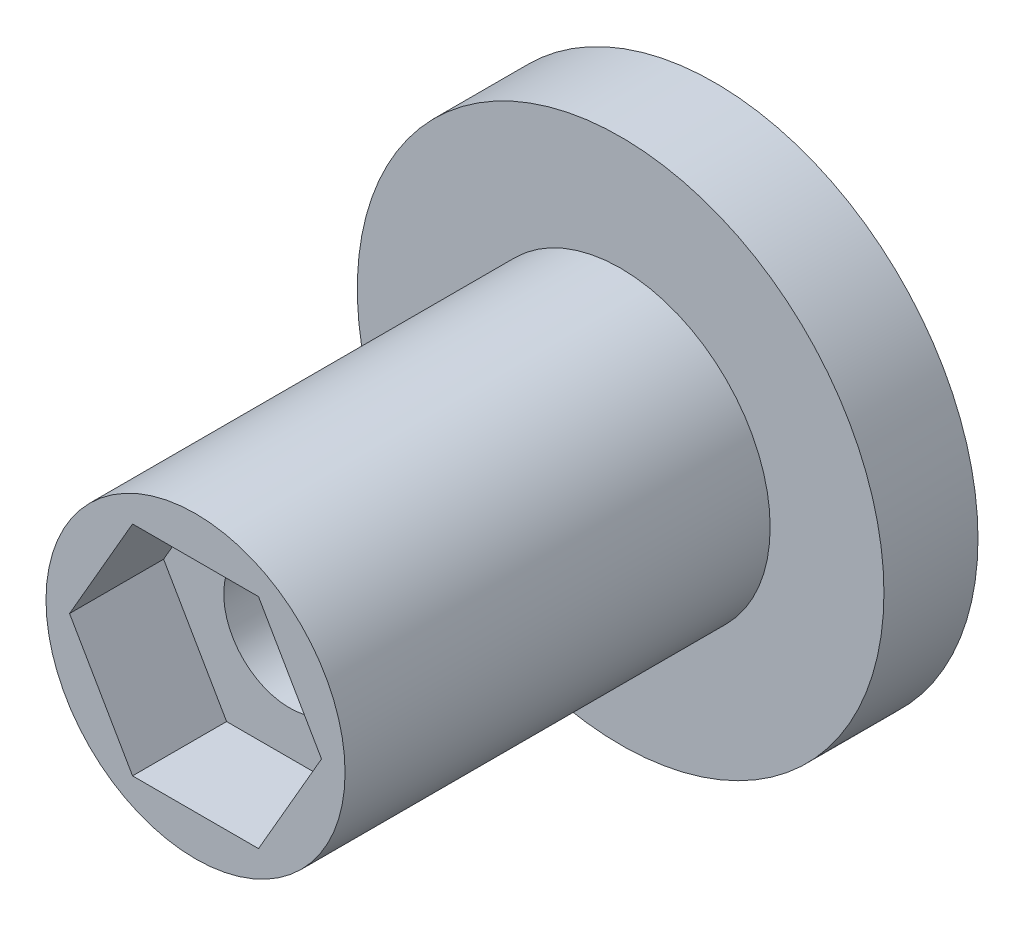
ISO-10303-21;
HEADER;
FILE_DESCRIPTION(('STEP AP214'),'2;1');
FILE_NAME('part.step','',(''),(''),'','','');
FILE_SCHEMA(('AUTOMOTIVE_DESIGN { 1 0 10303 214 1 1 1 1 }'));
ENDSEC;
DATA;
#1=APPLICATION_CONTEXT('core data for automotive mechanical design processes');
#2=APPLICATION_PROTOCOL_DEFINITION('international standard','automotive_design',2000,#1);
#3=PRODUCT_CONTEXT('',#1,'mechanical');
#4=PRODUCT('Part','Part','',(#3));
#5=PRODUCT_RELATED_PRODUCT_CATEGORY('part','',(#4));
#6=PRODUCT_DEFINITION_FORMATION('','',#4);
#7=PRODUCT_DEFINITION_CONTEXT('part definition',#1,'design');
#8=PRODUCT_DEFINITION('design','',#6,#7);
#9=PRODUCT_DEFINITION_SHAPE('','',#8);
#10=(LENGTH_UNIT() NAMED_UNIT(*) SI_UNIT(.MILLI.,.METRE.));
#11=(NAMED_UNIT(*) PLANE_ANGLE_UNIT() SI_UNIT($,.RADIAN.));
#12=(NAMED_UNIT(*) SI_UNIT($,.STERADIAN.) SOLID_ANGLE_UNIT());
#13=UNCERTAINTY_MEASURE_WITH_UNIT(LENGTH_MEASURE(1.E-05),#10,'distance_accuracy_value','');
#14=(GEOMETRIC_REPRESENTATION_CONTEXT(3) GLOBAL_UNCERTAINTY_ASSIGNED_CONTEXT((#13)) GLOBAL_UNIT_ASSIGNED_CONTEXT((#10,
#11,#12)) REPRESENTATION_CONTEXT('',''));
#15=CARTESIAN_POINT('',(0.,0.,0.));
#16=DIRECTION('',(0.,0.,1.));
#17=DIRECTION('',(1.,0.,0.));
#18=AXIS2_PLACEMENT_3D('',#15,#16,#17);
#19=CARTESIAN_POINT('',(3.348729792148,0.,-31.9));
#20=DIRECTION('',(-0.866025403784329,-0.50000000000019,0.));
#21=DIRECTION('',(-0.50000000000019,0.866025403784329,0.));
#22=AXIS2_PLACEMENT_3D('',#19,#20,#21);
#23=PLANE('',#22);
#24=DIRECTION('',(0.,0.,-1.));
#25=VECTOR('',#24,1.);
#26=CARTESIAN_POINT('',(3.348729792148,0.,-30.6));
#27=LINE('',#26,#25);
#28=CARTESIAN_POINT('',(3.348729792148,0.,-30.7));
#29=VERTEX_POINT('',#28);
#30=CARTESIAN_POINT('',(3.348729792148,0.,-33.2));
#31=VERTEX_POINT('',#30);
#32=EDGE_CURVE('E10',#29,#31,#27,.T.);
#33=ORIENTED_EDGE('',*,*,#32,.F.);
#34=DIRECTION('',(0.50000000000019,-0.866025403784329,0.));
#35=VECTOR('',#34,1.);
#36=CARTESIAN_POINT('',(2.930138568129,0.725021267602,-30.7));
#37=LINE('',#36,#35);
#38=CARTESIAN_POINT('',(1.674364896074,2.90008507041,-30.7));
#39=VERTEX_POINT('',#38);
#40=EDGE_CURVE('E178',#39,#29,#37,.T.);
#41=ORIENTED_EDGE('',*,*,#40,.F.);
#42=DIRECTION('',(0.,0.,1.));
#43=VECTOR('',#42,1.);
#44=CARTESIAN_POINT('',(1.674364896074,2.90008507041,-33.2));
#45=LINE('',#44,#43);
#46=CARTESIAN_POINT('',(1.674364896074,2.90008507041,-33.2));
#47=VERTEX_POINT('',#46);
#48=EDGE_CURVE('E122',#47,#39,#45,.T.);
#49=ORIENTED_EDGE('',*,*,#48,.F.);
#50=DIRECTION('',(-0.50000000000019,0.866025403784329,0.));
#51=VECTOR('',#50,1.);
#52=CARTESIAN_POINT('',(3.348729792148,0.,-33.2));
#53=LINE('',#52,#51);
#54=EDGE_CURVE('E135',#31,#47,#53,.T.);
#55=ORIENTED_EDGE('',*,*,#54,.F.);
#56=EDGE_LOOP('',(#33,#41,#49,#55));
#57=FACE_BOUND('',#56,.T.);
#58=ADVANCED_FACE('F15',(#57),#23,.T.);
#59=CARTESIAN_POINT('',(1.674364896074,-2.90008507041,-31.9));
#60=DIRECTION('',(-0.866025403784329,0.50000000000019,0.));
#61=DIRECTION('',(0.,0.,1.));
#62=AXIS2_PLACEMENT_3D('',#59,#60,#61);
#63=PLANE('',#62);
#64=DIRECTION('',(0.,0.,-1.));
#65=VECTOR('',#64,1.);
#66=CARTESIAN_POINT('',(1.674364896074,-2.90008507041,-30.6));
#67=LINE('',#66,#65);
#68=CARTESIAN_POINT('',(1.674364896074,-2.90008507041,-30.7));
#69=VERTEX_POINT('',#68);
#70=CARTESIAN_POINT('',(1.674364896074,-2.90008507041,-33.2));
#71=VERTEX_POINT('',#70);
#72=EDGE_CURVE('E23',#69,#71,#67,.T.);
#73=ORIENTED_EDGE('',*,*,#72,.F.);
#74=DIRECTION('',(-0.50000000000019,-0.866025403784329,0.));
#75=VECTOR('',#74,1.);
#76=CARTESIAN_POINT('',(2.092956120092,-2.175063802807,-30.7));
#77=LINE('',#76,#75);
#78=EDGE_CURVE('E183',#29,#69,#77,.T.);
#79=ORIENTED_EDGE('',*,*,#78,.F.);
#80=ORIENTED_EDGE('',*,*,#32,.T.);
#81=DIRECTION('',(0.50000000000019,0.866025403784329,0.));
#82=VECTOR('',#81,1.);
#83=CARTESIAN_POINT('',(1.674364896074,-2.90008507041,-33.2));
#84=LINE('',#83,#82);
#85=EDGE_CURVE('E153',#71,#31,#84,.T.);
#86=ORIENTED_EDGE('',*,*,#85,.F.);
#87=EDGE_LOOP('',(#73,#79,#80,#86));
#88=FACE_BOUND('',#87,.T.);
#89=ADVANCED_FACE('F196',(#88),#63,.T.);
#90=CARTESIAN_POINT('',(-1.674364896074,-2.90008507041,-31.9));
#91=DIRECTION('',(0.,1.,0.));
#92=DIRECTION('',(1.,0.,0.));
#93=AXIS2_PLACEMENT_3D('',#90,#91,#92);
#94=PLANE('',#93);
#95=DIRECTION('',(0.,0.,-1.));
#96=VECTOR('',#95,1.);
#97=CARTESIAN_POINT('',(-1.674364896074,-2.90008507041,-30.6));
#98=LINE('',#97,#96);
#99=CARTESIAN_POINT('',(-1.674364896074,-2.90008507041,-30.7));
#100=VERTEX_POINT('',#99);
#101=CARTESIAN_POINT('',(-1.674364896074,-2.90008507041,-33.2));
#102=VERTEX_POINT('',#101);
#103=EDGE_CURVE('E47',#100,#102,#98,.T.);
#104=ORIENTED_EDGE('',*,*,#103,.F.);
#105=DIRECTION('',(-1.,0.,0.));
#106=VECTOR('',#105,1.);
#107=CARTESIAN_POINT('',(-0.837182448037,-2.90008507041,-30.7));
#108=LINE('',#107,#106);
#109=EDGE_CURVE('E179',#69,#100,#108,.T.);
#110=ORIENTED_EDGE('',*,*,#109,.F.);
#111=ORIENTED_EDGE('',*,*,#72,.T.);
#112=DIRECTION('',(1.,0.,0.));
#113=VECTOR('',#112,1.);
#114=CARTESIAN_POINT('',(-1.674364896074,-2.90008507041,-33.2));
#115=LINE('',#114,#113);
#116=EDGE_CURVE('E149',#102,#71,#115,.T.);
#117=ORIENTED_EDGE('',*,*,#116,.F.);
#118=EDGE_LOOP('',(#104,#110,#111,#117));
#119=FACE_BOUND('',#118,.T.);
#120=ADVANCED_FACE('F197',(#119),#94,.T.);
#121=CARTESIAN_POINT('',(-3.348729792148,0.,-31.9));
#122=DIRECTION('',(0.866025403784329,0.50000000000019,0.));
#123=DIRECTION('',(0.,0.,-1.));
#124=AXIS2_PLACEMENT_3D('',#121,#122,#123);
#125=PLANE('',#124);
#126=DIRECTION('',(0.,0.,1.));
#127=VECTOR('',#126,1.);
#128=CARTESIAN_POINT('',(-3.348729792148,0.,-33.2));
#129=LINE('',#128,#127);
#130=CARTESIAN_POINT('',(-3.348729792148,0.,-33.2));
#131=VERTEX_POINT('',#130);
#132=CARTESIAN_POINT('',(-3.348729792148,0.,-30.7));
#133=VERTEX_POINT('',#132);
#134=EDGE_CURVE('E121',#131,#133,#129,.T.);
#135=ORIENTED_EDGE('',*,*,#134,.T.);
#136=DIRECTION('',(-0.50000000000019,0.866025403784329,0.));
#137=VECTOR('',#136,1.);
#138=CARTESIAN_POINT('',(-2.930138568129,-0.725021267602,-30.7));
#139=LINE('',#138,#137);
#140=EDGE_CURVE('E144',#100,#133,#139,.T.);
#141=ORIENTED_EDGE('',*,*,#140,.F.);
#142=ORIENTED_EDGE('',*,*,#103,.T.);
#143=DIRECTION('',(0.50000000000019,-0.866025403784329,0.));
#144=VECTOR('',#143,1.);
#145=CARTESIAN_POINT('',(-3.348729792148,0.,-33.2));
#146=LINE('',#145,#144);
#147=EDGE_CURVE('E130',#131,#102,#146,.T.);
#148=ORIENTED_EDGE('',*,*,#147,.F.);
#149=EDGE_LOOP('',(#135,#141,#142,#148));
#150=FACE_BOUND('',#149,.T.);
#151=ADVANCED_FACE('F198',(#150),#125,.T.);
#152=CARTESIAN_POINT('',(-1.674364896074,2.90008507041,-31.9));
#153=DIRECTION('',(0.866025403784329,-0.50000000000019,0.));
#154=DIRECTION('',(0.,0.,-1.));
#155=AXIS2_PLACEMENT_3D('',#152,#153,#154);
#156=PLANE('',#155);
#157=DIRECTION('',(0.,0.,1.));
#158=VECTOR('',#157,1.);
#159=CARTESIAN_POINT('',(-1.674364896074,2.90008507041,-33.2));
#160=LINE('',#159,#158);
#161=CARTESIAN_POINT('',(-1.674364896074,2.90008507041,-33.2));
#162=VERTEX_POINT('',#161);
#163=CARTESIAN_POINT('',(-1.674364896074,2.90008507041,-30.7));
#164=VERTEX_POINT('',#163);
#165=EDGE_CURVE('E109',#162,#164,#160,.T.);
#166=ORIENTED_EDGE('',*,*,#165,.T.);
#167=DIRECTION('',(0.50000000000019,0.866025403784329,0.));
#168=VECTOR('',#167,1.);
#169=CARTESIAN_POINT('',(-2.092956120092,2.175063802807,-30.7));
#170=LINE('',#169,#168);
#171=EDGE_CURVE('E141',#133,#164,#170,.T.);
#172=ORIENTED_EDGE('',*,*,#171,.F.);
#173=ORIENTED_EDGE('',*,*,#134,.F.);
#174=DIRECTION('',(-0.50000000000019,-0.866025403784329,0.));
#175=VECTOR('',#174,1.);
#176=CARTESIAN_POINT('',(-1.674364896074,2.90008507041,-33.2));
#177=LINE('',#176,#175);
#178=EDGE_CURVE('E125',#162,#131,#177,.T.);
#179=ORIENTED_EDGE('',*,*,#178,.F.);
#180=EDGE_LOOP('',(#166,#172,#173,#179));
#181=FACE_BOUND('',#180,.T.);
#182=ADVANCED_FACE('F126',(#181),#156,.T.);
#183=CARTESIAN_POINT('',(1.674364896074,2.90008507041,-31.9));
#184=DIRECTION('',(0.,-1.,0.));
#185=DIRECTION('',(-1.,0.,0.));
#186=AXIS2_PLACEMENT_3D('',#183,#184,#185);
#187=PLANE('',#186);
#188=ORIENTED_EDGE('',*,*,#48,.T.);
#189=DIRECTION('',(1.,0.,0.));
#190=VECTOR('',#189,1.);
#191=CARTESIAN_POINT('',(0.837182448037,2.90008507041,-30.7));
#192=LINE('',#191,#190);
#193=EDGE_CURVE('E116',#164,#39,#192,.T.);
#194=ORIENTED_EDGE('',*,*,#193,.F.);
#195=ORIENTED_EDGE('',*,*,#165,.F.);
#196=DIRECTION('',(-1.,0.,0.));
#197=VECTOR('',#196,1.);
#198=CARTESIAN_POINT('',(1.674364896074,2.90008507041,-33.2));
#199=LINE('',#198,#197);
#200=EDGE_CURVE('E113',#47,#162,#199,.T.);
#201=ORIENTED_EDGE('',*,*,#200,.F.);
#202=EDGE_LOOP('',(#188,#194,#195,#201));
#203=FACE_BOUND('',#202,.T.);
#204=ADVANCED_FACE('F111',(#203),#187,.T.);
#205=CARTESIAN_POINT('',(0.,0.,-33.2));
#206=DIRECTION('',(0.,0.,1.));
#207=DIRECTION('',(1.,0.,0.));
#208=AXIS2_PLACEMENT_3D('',#205,#206,#207);
#209=PLANE('',#208);
#210=CARTESIAN_POINT('',(0.,0.,-33.2));
#211=DIRECTION('',(0.,0.,1.));
#212=DIRECTION('',(1.,0.,0.));
#213=AXIS2_PLACEMENT_3D('',#210,#211,#212);
#214=CIRCLE('',#213,1.75);
#215=CARTESIAN_POINT('',(1.75,0.,-33.2));
#216=VERTEX_POINT('',#215);
#217=EDGE_CURVE('E167',#216,#216,#214,.T.);
#218=ORIENTED_EDGE('',*,*,#217,.F.);
#219=EDGE_LOOP('',(#218));
#220=FACE_BOUND('',#219,.T.);
#221=ORIENTED_EDGE('',*,*,#54,.T.);
#222=ORIENTED_EDGE('',*,*,#200,.T.);
#223=ORIENTED_EDGE('',*,*,#178,.T.);
#224=ORIENTED_EDGE('',*,*,#147,.T.);
#225=ORIENTED_EDGE('',*,*,#116,.T.);
#226=ORIENTED_EDGE('',*,*,#85,.T.);
#227=EDGE_LOOP('',(#221,#222,#223,#224,#225,#226));
#228=FACE_BOUND('',#227,.T.);
#229=ADVANCED_FACE('F132',(#220,#228),#209,.T.);
#230=CARTESIAN_POINT('',(0.,0.,-30.7));
#231=DIRECTION('',(0.,0.,1.));
#232=DIRECTION('',(1.,0.,0.));
#233=AXIS2_PLACEMENT_3D('',#230,#231,#232);
#234=PLANE('',#233);
#235=ORIENTED_EDGE('',*,*,#193,.T.);
#236=ORIENTED_EDGE('',*,*,#40,.T.);
#237=ORIENTED_EDGE('',*,*,#78,.T.);
#238=ORIENTED_EDGE('',*,*,#109,.T.);
#239=ORIENTED_EDGE('',*,*,#140,.T.);
#240=ORIENTED_EDGE('',*,*,#171,.T.);
#241=EDGE_LOOP('',(#235,#236,#237,#238,#239,#240));
#242=FACE_BOUND('',#241,.T.);
#243=CARTESIAN_POINT('',(0.,0.,-30.7));
#244=DIRECTION('',(0.,0.,1.));
#245=DIRECTION('',(1.,0.,0.));
#246=AXIS2_PLACEMENT_3D('',#243,#244,#245);
#247=CIRCLE('',#246,3.975);
#248=CARTESIAN_POINT('',(3.975,0.,-30.7));
#249=VERTEX_POINT('',#248);
#250=EDGE_CURVE('E166',#249,#249,#247,.T.);
#251=ORIENTED_EDGE('',*,*,#250,.T.);
#252=EDGE_LOOP('',(#251));
#253=FACE_BOUND('',#252,.T.);
#254=ADVANCED_FACE('F191',(#242,#253),#234,.T.);
#255=CARTESIAN_POINT('',(0.,0.,-45.));
#256=DIRECTION('',(0.,0.,1.));
#257=DIRECTION('',(1.,0.,0.));
#258=AXIS2_PLACEMENT_3D('',#255,#256,#257);
#259=CYLINDRICAL_SURFACE('',#258,1.75);
#260=DIRECTION('',(0.,0.,1.));
#261=VECTOR('',#260,1.);
#262=CARTESIAN_POINT('',(1.75,0.,-45.));
#263=LINE('',#262,#261);
#264=CARTESIAN_POINT('',(1.75,0.,-44.5));
#265=VERTEX_POINT('',#264);
#266=EDGE_CURVE('E169',#265,#216,#263,.T.);
#267=ORIENTED_EDGE('',*,*,#266,.F.);
#268=CARTESIAN_POINT('',(0.,0.,-44.5));
#269=DIRECTION('',(0.,0.,1.));
#270=DIRECTION('',(1.,0.,0.));
#271=AXIS2_PLACEMENT_3D('',#268,#269,#270);
#272=CIRCLE('',#271,1.75);
#273=EDGE_CURVE('E209',#265,#265,#272,.T.);
#274=ORIENTED_EDGE('',*,*,#273,.F.);
#275=ORIENTED_EDGE('',*,*,#266,.T.);
#276=ORIENTED_EDGE('',*,*,#217,.T.);
#277=EDGE_LOOP('',(#267,#274,#275,#276));
#278=FACE_BOUND('',#277,.T.);
#279=ADVANCED_FACE('F261',(#278),#259,.F.);
#280=CARTESIAN_POINT('',(0.,0.,-42.));
#281=DIRECTION('',(0.,0.,1.));
#282=DIRECTION('',(1.,0.,0.));
#283=AXIS2_PLACEMENT_3D('',#280,#281,#282);
#284=CYLINDRICAL_SURFACE('',#283,3.975);
#285=ORIENTED_EDGE('',*,*,#250,.F.);
#286=DIRECTION('',(0.,0.,1.));
#287=VECTOR('',#286,1.);
#288=CARTESIAN_POINT('',(3.975,0.,-42.));
#289=LINE('',#288,#287);
#290=CARTESIAN_POINT('',(3.975,0.,-42.));
#291=VERTEX_POINT('',#290);
#292=EDGE_CURVE('E170',#291,#249,#289,.T.);
#293=ORIENTED_EDGE('',*,*,#292,.F.);
#294=CARTESIAN_POINT('',(0.,0.,-42.));
#295=DIRECTION('',(0.,0.,1.));
#296=DIRECTION('',(1.,0.,0.));
#297=AXIS2_PLACEMENT_3D('',#294,#295,#296);
#298=CIRCLE('',#297,3.975);
#299=EDGE_CURVE('E212',#291,#291,#298,.T.);
#300=ORIENTED_EDGE('',*,*,#299,.T.);
#301=ORIENTED_EDGE('',*,*,#292,.T.);
#302=EDGE_LOOP('',(#285,#293,#300,#301));
#303=FACE_BOUND('',#302,.T.);
#304=ADVANCED_FACE('F258',(#303),#284,.T.);
#305=CARTESIAN_POINT('',(0.,0.,-44.5));
#306=DIRECTION('',(0.,0.,1.));
#307=DIRECTION('',(1.,0.,0.));
#308=AXIS2_PLACEMENT_3D('',#305,#306,#307);
#309=PLANE('',#308);
#310=ORIENTED_EDGE('',*,*,#273,.T.);
#311=EDGE_LOOP('',(#310));
#312=FACE_BOUND('',#311,.T.);
#313=CARTESIAN_POINT('',(0.,0.,-44.5));
#314=DIRECTION('',(0.,0.,1.));
#315=DIRECTION('',(1.,0.,0.));
#316=AXIS2_PLACEMENT_3D('',#313,#314,#315);
#317=CIRCLE('',#316,7.);
#318=CARTESIAN_POINT('',(7.,0.,-44.5));
#319=VERTEX_POINT('',#318);
#320=EDGE_CURVE('E207',#319,#319,#317,.T.);
#321=ORIENTED_EDGE('',*,*,#320,.F.);
#322=EDGE_LOOP('',(#321));
#323=FACE_BOUND('',#322,.T.);
#324=ADVANCED_FACE('F242',(#312,#323),#309,.F.);
#325=CARTESIAN_POINT('',(0.,0.,-42.));
#326=DIRECTION('',(0.,0.,1.));
#327=DIRECTION('',(1.,0.,0.));
#328=AXIS2_PLACEMENT_3D('',#325,#326,#327);
#329=PLANE('',#328);
#330=ORIENTED_EDGE('',*,*,#299,.F.);
#331=EDGE_LOOP('',(#330));
#332=FACE_BOUND('',#331,.T.);
#333=CARTESIAN_POINT('',(0.,0.,-42.));
#334=DIRECTION('',(0.,0.,1.));
#335=DIRECTION('',(1.,0.,0.));
#336=AXIS2_PLACEMENT_3D('',#333,#334,#335);
#337=CIRCLE('',#336,7.);
#338=CARTESIAN_POINT('',(7.,0.,-42.));
#339=VERTEX_POINT('',#338);
#340=EDGE_CURVE('E226',#339,#339,#337,.T.);
#341=ORIENTED_EDGE('',*,*,#340,.T.);
#342=EDGE_LOOP('',(#341));
#343=FACE_BOUND('',#342,.T.);
#344=ADVANCED_FACE('F234',(#332,#343),#329,.T.);
#345=CARTESIAN_POINT('',(0.,0.,-44.5));
#346=DIRECTION('',(0.,0.,1.));
#347=DIRECTION('',(1.,0.,0.));
#348=AXIS2_PLACEMENT_3D('',#345,#346,#347);
#349=CYLINDRICAL_SURFACE('',#348,7.);
#350=ORIENTED_EDGE('',*,*,#340,.F.);
#351=DIRECTION('',(0.,0.,1.));
#352=VECTOR('',#351,1.);
#353=CARTESIAN_POINT('',(7.,0.,-44.5));
#354=LINE('',#353,#352);
#355=EDGE_CURVE('E220',#319,#339,#354,.T.);
#356=ORIENTED_EDGE('',*,*,#355,.F.);
#357=ORIENTED_EDGE('',*,*,#320,.T.);
#358=ORIENTED_EDGE('',*,*,#355,.T.);
#359=EDGE_LOOP('',(#350,#356,#357,#358));
#360=FACE_BOUND('',#359,.T.);
#361=ADVANCED_FACE('F235',(#360),#349,.T.);
#362=CLOSED_SHELL('',(#58,#89,#120,#151,#182,#204,#229,#254,#279,#304,#324,#344,#361));
#363=MANIFOLD_SOLID_BREP('B1',#362);
#364=ADVANCED_BREP_SHAPE_REPRESENTATION('',(#18,#363),#14);
#365=SHAPE_DEFINITION_REPRESENTATION(#9,#364);
ENDSEC;
END-ISO-10303-21;
